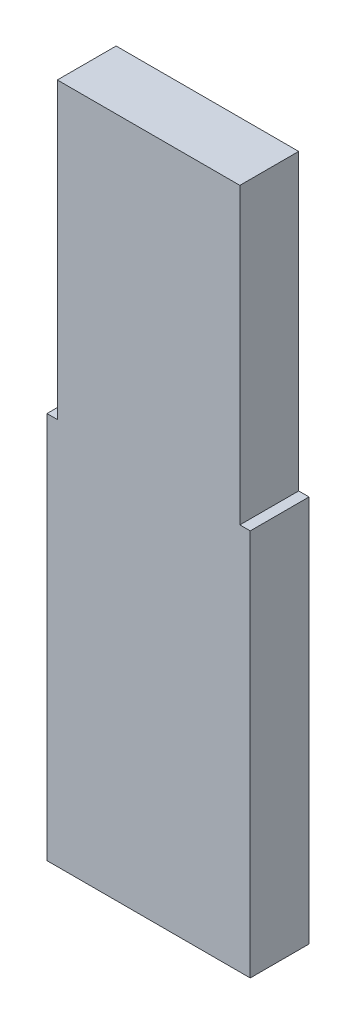
ISO-10303-21;
HEADER;
FILE_DESCRIPTION(('STEP AP214'),'2;1');
FILE_NAME('part.step','',(''),(''),'','','');
FILE_SCHEMA(('AUTOMOTIVE_DESIGN { 1 0 10303 214 1 1 1 1 }'));
ENDSEC;
DATA;
#1=APPLICATION_CONTEXT('core data for automotive mechanical design processes');
#2=APPLICATION_PROTOCOL_DEFINITION('international standard','automotive_design',2000,#1);
#3=PRODUCT_CONTEXT('',#1,'mechanical');
#4=PRODUCT('Part','Part','',(#3));
#5=PRODUCT_RELATED_PRODUCT_CATEGORY('part','',(#4));
#6=PRODUCT_DEFINITION_FORMATION('','',#4);
#7=PRODUCT_DEFINITION_CONTEXT('part definition',#1,'design');
#8=PRODUCT_DEFINITION('design','',#6,#7);
#9=PRODUCT_DEFINITION_SHAPE('','',#8);
#10=(LENGTH_UNIT() NAMED_UNIT(*) SI_UNIT(.MILLI.,.METRE.));
#11=(NAMED_UNIT(*) PLANE_ANGLE_UNIT() SI_UNIT($,.RADIAN.));
#12=(NAMED_UNIT(*) SI_UNIT($,.STERADIAN.) SOLID_ANGLE_UNIT());
#13=UNCERTAINTY_MEASURE_WITH_UNIT(LENGTH_MEASURE(1.E-05),#10,'distance_accuracy_value','');
#14=(GEOMETRIC_REPRESENTATION_CONTEXT(3) GLOBAL_UNCERTAINTY_ASSIGNED_CONTEXT((#13)) GLOBAL_UNIT_ASSIGNED_CONTEXT((#10,
#11,#12)) REPRESENTATION_CONTEXT('',''));
#15=CARTESIAN_POINT('',(0.,0.,0.));
#16=DIRECTION('',(0.,0.,1.));
#17=DIRECTION('',(1.,0.,0.));
#18=AXIS2_PLACEMENT_3D('',#15,#16,#17);
#19=CARTESIAN_POINT('',(40.8052485316472,-22.4809394479898,1.5875));
#20=DIRECTION('',(1.,0.,0.));
#21=DIRECTION('',(0.,0.,-1.));
#22=AXIS2_PLACEMENT_3D('',#19,#20,#21);
#23=PLANE('',#22);
#24=DIRECTION('',(0.,-1.,0.));
#25=VECTOR('',#24,1.);
#26=CARTESIAN_POINT('',(40.8052485316472,-22.4809394479898,-1.5875));
#27=LINE('',#26,#25);
#28=CARTESIAN_POINT('',(40.8052485316472,-6.60593944798983,-1.5875));
#29=VERTEX_POINT('',#28);
#30=CARTESIAN_POINT('',(40.8052485316472,-22.4809394479898,-1.5875));
#31=VERTEX_POINT('',#30);
#32=EDGE_CURVE('E132',#29,#31,#27,.T.);
#33=ORIENTED_EDGE('',*,*,#32,.T.);
#34=DIRECTION('',(0.,0.,-1.));
#35=VECTOR('',#34,1.);
#36=CARTESIAN_POINT('',(40.8052485316472,-22.4809394479898,1.5875));
#37=LINE('',#36,#35);
#38=CARTESIAN_POINT('',(40.8052485316472,-22.4809394479898,1.5875));
#39=VERTEX_POINT('',#38);
#40=EDGE_CURVE('E11',#39,#31,#37,.T.);
#41=ORIENTED_EDGE('',*,*,#40,.F.);
#42=DIRECTION('',(0.,-1.,0.));
#43=VECTOR('',#42,1.);
#44=CARTESIAN_POINT('',(40.8052485316472,-22.4809394479898,1.5875));
#45=LINE('',#44,#43);
#46=CARTESIAN_POINT('',(40.8052485316472,-6.60593944798983,1.5875));
#47=VERTEX_POINT('',#46);
#48=EDGE_CURVE('E146',#47,#39,#45,.T.);
#49=ORIENTED_EDGE('',*,*,#48,.F.);
#50=DIRECTION('',(0.,0.,-1.));
#51=VECTOR('',#50,1.);
#52=CARTESIAN_POINT('',(40.8052485316472,-6.60593944798983,1.5875));
#53=LINE('',#52,#51);
#54=EDGE_CURVE('E128',#47,#29,#53,.T.);
#55=ORIENTED_EDGE('',*,*,#54,.T.);
#56=EDGE_LOOP('',(#33,#41,#49,#55));
#57=FACE_BOUND('',#56,.T.);
#58=ADVANCED_FACE('F36',(#57),#23,.F.);
#59=CARTESIAN_POINT('',(40.2461212011876,-22.4809394479898,1.5875));
#60=DIRECTION('',(0.,-1.,0.));
#61=DIRECTION('',(0.,0.,-1.));
#62=AXIS2_PLACEMENT_3D('',#59,#60,#61);
#63=PLANE('',#62);
#64=DIRECTION('',(-1.,0.,0.));
#65=VECTOR('',#64,1.);
#66=CARTESIAN_POINT('',(40.2461212011876,-22.4809394479898,-1.5875));
#67=LINE('',#66,#65);
#68=CARTESIAN_POINT('',(40.2461212011876,-22.4809394479898,-1.5875));
#69=VERTEX_POINT('',#68);
#70=EDGE_CURVE('E135',#31,#69,#67,.T.);
#71=ORIENTED_EDGE('',*,*,#70,.T.);
#72=DIRECTION('',(0.,0.,-1.));
#73=VECTOR('',#72,1.);
#74=CARTESIAN_POINT('',(40.2461212011876,-22.4809394479898,1.5875));
#75=LINE('',#74,#73);
#76=CARTESIAN_POINT('',(40.2461212011876,-22.4809394479898,1.5875));
#77=VERTEX_POINT('',#76);
#78=EDGE_CURVE('E44',#77,#69,#75,.T.);
#79=ORIENTED_EDGE('',*,*,#78,.F.);
#80=DIRECTION('',(-1.,0.,0.));
#81=VECTOR('',#80,1.);
#82=CARTESIAN_POINT('',(40.2461212011876,-22.4809394479898,1.5875));
#83=LINE('',#82,#81);
#84=EDGE_CURVE('E95',#39,#77,#83,.T.);
#85=ORIENTED_EDGE('',*,*,#84,.F.);
#86=ORIENTED_EDGE('',*,*,#40,.T.);
#87=EDGE_LOOP('',(#71,#79,#85,#86));
#88=FACE_BOUND('',#87,.T.);
#89=ADVANCED_FACE('F181',(#88),#63,.F.);
#90=CARTESIAN_POINT('',(40.2461212011876,-43.3851394479898,1.5875));
#91=DIRECTION('',(1.,0.,0.));
#92=DIRECTION('',(0.,1.,0.));
#93=AXIS2_PLACEMENT_3D('',#90,#91,#92);
#94=PLANE('',#93);
#95=DIRECTION('',(0.,-1.,0.));
#96=VECTOR('',#95,1.);
#97=CARTESIAN_POINT('',(40.2461212011876,-43.3851394479898,-1.5875));
#98=LINE('',#97,#96);
#99=CARTESIAN_POINT('',(40.2461212011876,-43.3851394479898,-1.5875));
#100=VERTEX_POINT('',#99);
#101=EDGE_CURVE('E137',#69,#100,#98,.T.);
#102=ORIENTED_EDGE('',*,*,#101,.T.);
#103=DIRECTION('',(0.,0.,-1.));
#104=VECTOR('',#103,1.);
#105=CARTESIAN_POINT('',(40.2461212011876,-43.3851394479898,1.5875));
#106=LINE('',#105,#104);
#107=CARTESIAN_POINT('',(40.2461212011876,-43.3851394479898,1.5875));
#108=VERTEX_POINT('',#107);
#109=EDGE_CURVE('E153',#108,#100,#106,.T.);
#110=ORIENTED_EDGE('',*,*,#109,.F.);
#111=DIRECTION('',(0.,-1.,0.));
#112=VECTOR('',#111,1.);
#113=CARTESIAN_POINT('',(40.2461212011876,-43.3851394479898,1.5875));
#114=LINE('',#113,#112);
#115=EDGE_CURVE('E161',#77,#108,#114,.T.);
#116=ORIENTED_EDGE('',*,*,#115,.F.);
#117=ORIENTED_EDGE('',*,*,#78,.T.);
#118=EDGE_LOOP('',(#102,#110,#116,#117));
#119=FACE_BOUND('',#118,.T.);
#120=ADVANCED_FACE('F159',(#119),#94,.F.);
#121=CARTESIAN_POINT('',(51.2189212011876,-43.3851394479898,1.5875));
#122=DIRECTION('',(0.,1.,0.));
#123=DIRECTION('',(0.,0.,1.));
#124=AXIS2_PLACEMENT_3D('',#121,#122,#123);
#125=PLANE('',#124);
#126=DIRECTION('',(1.,0.,0.));
#127=VECTOR('',#126,1.);
#128=CARTESIAN_POINT('',(51.2189212011876,-43.3851394479898,-1.5875));
#129=LINE('',#128,#127);
#130=CARTESIAN_POINT('',(51.2189212011876,-43.3851394479898,-1.5875));
#131=VERTEX_POINT('',#130);
#132=EDGE_CURVE('E139',#100,#131,#129,.T.);
#133=ORIENTED_EDGE('',*,*,#132,.T.);
#134=DIRECTION('',(0.,0.,-1.));
#135=VECTOR('',#134,1.);
#136=CARTESIAN_POINT('',(51.2189212011876,-43.3851394479898,1.5875));
#137=LINE('',#136,#135);
#138=CARTESIAN_POINT('',(51.2189212011876,-43.3851394479898,1.5875));
#139=VERTEX_POINT('',#138);
#140=EDGE_CURVE('E150',#139,#131,#137,.T.);
#141=ORIENTED_EDGE('',*,*,#140,.F.);
#142=DIRECTION('',(1.,0.,0.));
#143=VECTOR('',#142,1.);
#144=CARTESIAN_POINT('',(51.2189212011876,-43.3851394479898,1.5875));
#145=LINE('',#144,#143);
#146=EDGE_CURVE('E173',#108,#139,#145,.T.);
#147=ORIENTED_EDGE('',*,*,#146,.F.);
#148=ORIENTED_EDGE('',*,*,#109,.T.);
#149=EDGE_LOOP('',(#133,#141,#147,#148));
#150=FACE_BOUND('',#149,.T.);
#151=ADVANCED_FACE('F169',(#150),#125,.F.);
#152=CARTESIAN_POINT('',(51.2189212011876,-22.4809394479898,1.5875));
#153=DIRECTION('',(-1.,0.,0.));
#154=DIRECTION('',(0.,0.,1.));
#155=AXIS2_PLACEMENT_3D('',#152,#153,#154);
#156=PLANE('',#155);
#157=DIRECTION('',(0.,1.,0.));
#158=VECTOR('',#157,1.);
#159=CARTESIAN_POINT('',(51.2189212011876,-22.4809394479898,-1.5875));
#160=LINE('',#159,#158);
#161=CARTESIAN_POINT('',(51.2189212011876,-22.4809394479898,-1.5875));
#162=VERTEX_POINT('',#161);
#163=EDGE_CURVE('E141',#131,#162,#160,.T.);
#164=ORIENTED_EDGE('',*,*,#163,.T.);
#165=DIRECTION('',(0.,0.,-1.));
#166=VECTOR('',#165,1.);
#167=CARTESIAN_POINT('',(51.2189212011876,-22.4809394479898,1.5875));
#168=LINE('',#167,#166);
#169=CARTESIAN_POINT('',(51.2189212011876,-22.4809394479898,1.5875));
#170=VERTEX_POINT('',#169);
#171=EDGE_CURVE('E123',#170,#162,#168,.T.);
#172=ORIENTED_EDGE('',*,*,#171,.F.);
#173=DIRECTION('',(0.,1.,0.));
#174=VECTOR('',#173,1.);
#175=CARTESIAN_POINT('',(51.2189212011876,-22.4809394479898,1.5875));
#176=LINE('',#175,#174);
#177=EDGE_CURVE('E114',#139,#170,#176,.T.);
#178=ORIENTED_EDGE('',*,*,#177,.F.);
#179=ORIENTED_EDGE('',*,*,#140,.T.);
#180=EDGE_LOOP('',(#164,#172,#178,#179));
#181=FACE_BOUND('',#180,.T.);
#182=ADVANCED_FACE('F172',(#181),#156,.F.);
#183=CARTESIAN_POINT('',(50.659793870728,-22.4809394479898,1.5875));
#184=DIRECTION('',(0.,-1.,0.));
#185=DIRECTION('',(1.,0.,0.));
#186=AXIS2_PLACEMENT_3D('',#183,#184,#185);
#187=PLANE('',#186);
#188=DIRECTION('',(-1.,0.,0.));
#189=VECTOR('',#188,1.);
#190=CARTESIAN_POINT('',(50.659793870728,-22.4809394479898,-1.5875));
#191=LINE('',#190,#189);
#192=CARTESIAN_POINT('',(50.659793870728,-22.4809394479898,-1.5875));
#193=VERTEX_POINT('',#192);
#194=EDGE_CURVE('E122',#162,#193,#191,.T.);
#195=ORIENTED_EDGE('',*,*,#194,.T.);
#196=DIRECTION('',(0.,0.,-1.));
#197=VECTOR('',#196,1.);
#198=CARTESIAN_POINT('',(50.659793870728,-22.4809394479898,1.5875));
#199=LINE('',#198,#197);
#200=CARTESIAN_POINT('',(50.659793870728,-22.4809394479898,1.5875));
#201=VERTEX_POINT('',#200);
#202=EDGE_CURVE('E119',#201,#193,#199,.T.);
#203=ORIENTED_EDGE('',*,*,#202,.F.);
#204=DIRECTION('',(-1.,0.,0.));
#205=VECTOR('',#204,1.);
#206=CARTESIAN_POINT('',(50.659793870728,-22.4809394479898,1.5875));
#207=LINE('',#206,#205);
#208=EDGE_CURVE('E108',#170,#201,#207,.T.);
#209=ORIENTED_EDGE('',*,*,#208,.F.);
#210=ORIENTED_EDGE('',*,*,#171,.T.);
#211=EDGE_LOOP('',(#195,#203,#209,#210));
#212=FACE_BOUND('',#211,.T.);
#213=ADVANCED_FACE('F120',(#212),#187,.F.);
#214=CARTESIAN_POINT('',(50.659793870728,-6.60593944798983,1.5875));
#215=DIRECTION('',(-1.,0.,0.));
#216=DIRECTION('',(0.,0.,1.));
#217=AXIS2_PLACEMENT_3D('',#214,#215,#216);
#218=PLANE('',#217);
#219=DIRECTION('',(0.,1.,0.));
#220=VECTOR('',#219,1.);
#221=CARTESIAN_POINT('',(50.659793870728,-6.60593944798983,-1.5875));
#222=LINE('',#221,#220);
#223=CARTESIAN_POINT('',(50.659793870728,-6.60593944798983,-1.5875));
#224=VERTEX_POINT('',#223);
#225=EDGE_CURVE('E81',#193,#224,#222,.T.);
#226=ORIENTED_EDGE('',*,*,#225,.T.);
#227=DIRECTION('',(0.,0.,-1.));
#228=VECTOR('',#227,1.);
#229=CARTESIAN_POINT('',(50.659793870728,-6.60593944798983,1.5875));
#230=LINE('',#229,#228);
#231=CARTESIAN_POINT('',(50.659793870728,-6.60593944798983,1.5875));
#232=VERTEX_POINT('',#231);
#233=EDGE_CURVE('E124',#232,#224,#230,.T.);
#234=ORIENTED_EDGE('',*,*,#233,.F.);
#235=DIRECTION('',(0.,1.,0.));
#236=VECTOR('',#235,1.);
#237=CARTESIAN_POINT('',(50.659793870728,-6.60593944798983,1.5875));
#238=LINE('',#237,#236);
#239=EDGE_CURVE('E112',#201,#232,#238,.T.);
#240=ORIENTED_EDGE('',*,*,#239,.F.);
#241=ORIENTED_EDGE('',*,*,#202,.T.);
#242=EDGE_LOOP('',(#226,#234,#240,#241));
#243=FACE_BOUND('',#242,.T.);
#244=ADVANCED_FACE('F126',(#243),#218,.F.);
#245=CARTESIAN_POINT('',(40.8052485316472,-6.60593944798983,1.5875));
#246=DIRECTION('',(0.,-1.,0.));
#247=DIRECTION('',(1.,0.,0.));
#248=AXIS2_PLACEMENT_3D('',#245,#246,#247);
#249=PLANE('',#248);
#250=DIRECTION('',(-1.,0.,0.));
#251=VECTOR('',#250,1.);
#252=CARTESIAN_POINT('',(40.8052485316472,-6.60593944798983,-1.5875));
#253=LINE('',#252,#251);
#254=EDGE_CURVE('E87',#224,#29,#253,.T.);
#255=ORIENTED_EDGE('',*,*,#254,.T.);
#256=ORIENTED_EDGE('',*,*,#54,.F.);
#257=DIRECTION('',(-1.,0.,0.));
#258=VECTOR('',#257,1.);
#259=CARTESIAN_POINT('',(40.8052485316472,-6.60593944798983,1.5875));
#260=LINE('',#259,#258);
#261=EDGE_CURVE('E52',#232,#47,#260,.T.);
#262=ORIENTED_EDGE('',*,*,#261,.F.);
#263=ORIENTED_EDGE('',*,*,#233,.T.);
#264=EDGE_LOOP('',(#255,#256,#262,#263));
#265=FACE_BOUND('',#264,.T.);
#266=ADVANCED_FACE('F197',(#265),#249,.F.);
#267=CARTESIAN_POINT('',(0.,0.,1.5875));
#268=DIRECTION('',(0.,0.,-1.));
#269=DIRECTION('',(-1.,0.,0.));
#270=AXIS2_PLACEMENT_3D('',#267,#268,#269);
#271=PLANE('',#270);
#272=ORIENTED_EDGE('',*,*,#48,.T.);
#273=ORIENTED_EDGE('',*,*,#84,.T.);
#274=ORIENTED_EDGE('',*,*,#115,.T.);
#275=ORIENTED_EDGE('',*,*,#146,.T.);
#276=ORIENTED_EDGE('',*,*,#177,.T.);
#277=ORIENTED_EDGE('',*,*,#208,.T.);
#278=ORIENTED_EDGE('',*,*,#239,.T.);
#279=ORIENTED_EDGE('',*,*,#261,.T.);
#280=EDGE_LOOP('',(#272,#273,#274,#275,#276,#277,#278,#279));
#281=FACE_BOUND('',#280,.T.);
#282=ADVANCED_FACE('F110',(#281),#271,.F.);
#283=CARTESIAN_POINT('',(0.,0.,-1.5875));
#284=DIRECTION('',(0.,0.,-1.));
#285=DIRECTION('',(-1.,0.,0.));
#286=AXIS2_PLACEMENT_3D('',#283,#284,#285);
#287=PLANE('',#286);
#288=ORIENTED_EDGE('',*,*,#32,.F.);
#289=ORIENTED_EDGE('',*,*,#254,.F.);
#290=ORIENTED_EDGE('',*,*,#225,.F.);
#291=ORIENTED_EDGE('',*,*,#194,.F.);
#292=ORIENTED_EDGE('',*,*,#163,.F.);
#293=ORIENTED_EDGE('',*,*,#132,.F.);
#294=ORIENTED_EDGE('',*,*,#101,.F.);
#295=ORIENTED_EDGE('',*,*,#70,.F.);
#296=EDGE_LOOP('',(#288,#289,#290,#291,#292,#293,#294,#295));
#297=FACE_BOUND('',#296,.T.);
#298=ADVANCED_FACE('F165',(#297),#287,.T.);
#299=CLOSED_SHELL('',(#58,#89,#120,#151,#182,#213,#244,#266,#282,#298));
#300=MANIFOLD_SOLID_BREP('B2',#299);
#301=ADVANCED_BREP_SHAPE_REPRESENTATION('',(#18,#300),#14);
#302=SHAPE_DEFINITION_REPRESENTATION(#9,#301);
ENDSEC;
END-ISO-10303-21;
